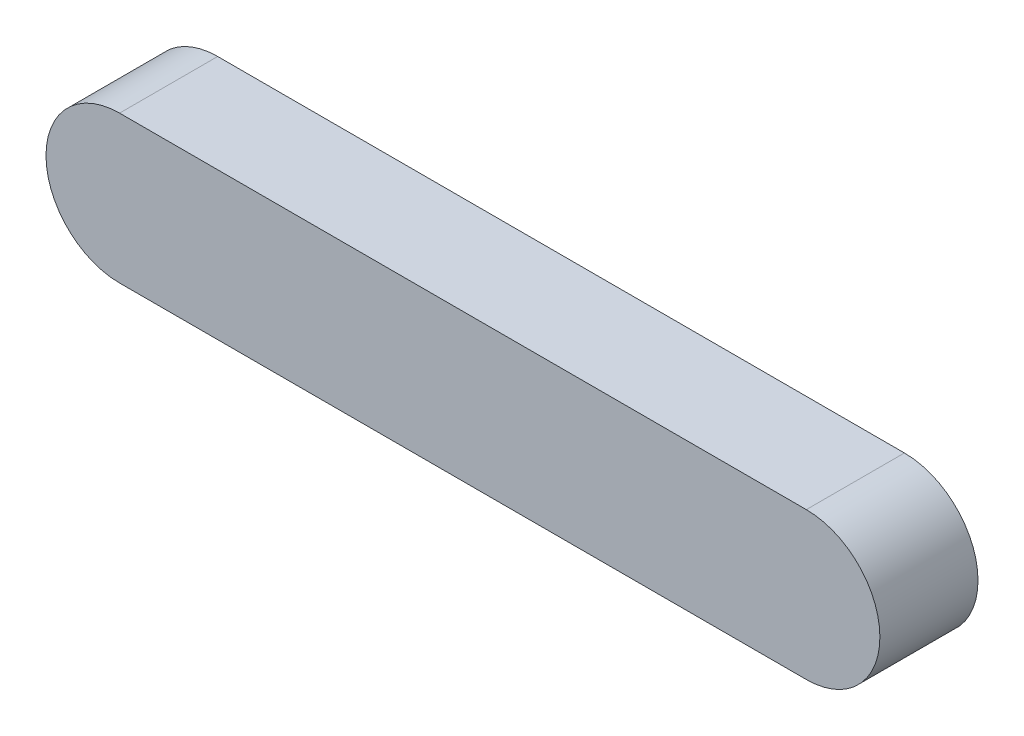
ISO-10303-21;
HEADER;
FILE_DESCRIPTION(('STEP AP214'),'2;1');
FILE_NAME('part.step','',(''),(''),'','','');
FILE_SCHEMA(('AUTOMOTIVE_DESIGN { 1 0 10303 214 1 1 1 1 }'));
ENDSEC;
DATA;
#1=APPLICATION_CONTEXT('core data for automotive mechanical design processes');
#2=APPLICATION_PROTOCOL_DEFINITION('international standard','automotive_design',2000,#1);
#3=PRODUCT_CONTEXT('',#1,'mechanical');
#4=PRODUCT('Part','Part','',(#3));
#5=PRODUCT_RELATED_PRODUCT_CATEGORY('part','',(#4));
#6=PRODUCT_DEFINITION_FORMATION('','',#4);
#7=PRODUCT_DEFINITION_CONTEXT('part definition',#1,'design');
#8=PRODUCT_DEFINITION('design','',#6,#7);
#9=PRODUCT_DEFINITION_SHAPE('','',#8);
#10=(LENGTH_UNIT() NAMED_UNIT(*) SI_UNIT(.MILLI.,.METRE.));
#11=(NAMED_UNIT(*) PLANE_ANGLE_UNIT() SI_UNIT($,.RADIAN.));
#12=(NAMED_UNIT(*) SI_UNIT($,.STERADIAN.) SOLID_ANGLE_UNIT());
#13=UNCERTAINTY_MEASURE_WITH_UNIT(LENGTH_MEASURE(1.E-05),#10,'distance_accuracy_value','');
#14=(GEOMETRIC_REPRESENTATION_CONTEXT(3) GLOBAL_UNCERTAINTY_ASSIGNED_CONTEXT((#13)) GLOBAL_UNIT_ASSIGNED_CONTEXT((#10,
#11,#12)) REPRESENTATION_CONTEXT('',''));
#15=CARTESIAN_POINT('',(0.,0.,0.));
#16=DIRECTION('',(0.,0.,1.));
#17=DIRECTION('',(1.,0.,0.));
#18=AXIS2_PLACEMENT_3D('',#15,#16,#17);
#19=CARTESIAN_POINT('',(70.,0.,10.));
#20=DIRECTION('',(0.,0.,-1.));
#21=DIRECTION('',(-1.,0.,0.));
#22=AXIS2_PLACEMENT_3D('',#19,#20,#21);
#23=CYLINDRICAL_SURFACE('',#22,7.5);
#24=CARTESIAN_POINT('',(70.,0.,0.));
#25=DIRECTION('',(0.,0.,1.));
#26=DIRECTION('',(1.,0.,0.));
#27=AXIS2_PLACEMENT_3D('',#24,#25,#26);
#28=CIRCLE('',#27,7.5);
#29=CARTESIAN_POINT('',(70.,-7.5,0.));
#30=VERTEX_POINT('',#29);
#31=CARTESIAN_POINT('',(70.,7.5,0.));
#32=VERTEX_POINT('',#31);
#33=EDGE_CURVE('E104',#30,#32,#28,.T.);
#34=ORIENTED_EDGE('',*,*,#33,.T.);
#35=DIRECTION('',(0.,0.,-1.));
#36=VECTOR('',#35,1.);
#37=CARTESIAN_POINT('',(70.,7.5,10.));
#38=LINE('',#37,#36);
#39=CARTESIAN_POINT('',(70.,7.5,10.));
#40=VERTEX_POINT('',#39);
#41=EDGE_CURVE('E11',#40,#32,#38,.T.);
#42=ORIENTED_EDGE('',*,*,#41,.F.);
#43=CARTESIAN_POINT('',(70.,0.,10.));
#44=DIRECTION('',(0.,0.,1.));
#45=DIRECTION('',(1.,0.,0.));
#46=AXIS2_PLACEMENT_3D('',#43,#44,#45);
#47=CIRCLE('',#46,7.5);
#48=CARTESIAN_POINT('',(70.,-7.5,10.));
#49=VERTEX_POINT('',#48);
#50=EDGE_CURVE('E92',#49,#40,#47,.T.);
#51=ORIENTED_EDGE('',*,*,#50,.F.);
#52=DIRECTION('',(0.,0.,-1.));
#53=VECTOR('',#52,1.);
#54=CARTESIAN_POINT('',(70.,-7.5,10.));
#55=LINE('',#54,#53);
#56=EDGE_CURVE('E100',#49,#30,#55,.T.);
#57=ORIENTED_EDGE('',*,*,#56,.T.);
#58=EDGE_LOOP('',(#34,#42,#51,#57));
#59=FACE_BOUND('',#58,.T.);
#60=ADVANCED_FACE('F41',(#59),#23,.T.);
#61=CARTESIAN_POINT('',(70.,7.5,10.));
#62=DIRECTION('',(0.,-1.,0.));
#63=DIRECTION('',(1.,0.,0.));
#64=AXIS2_PLACEMENT_3D('',#61,#62,#63);
#65=PLANE('',#64);
#66=DIRECTION('',(-1.,0.,0.));
#67=VECTOR('',#66,1.);
#68=CARTESIAN_POINT('',(70.,7.5,0.));
#69=LINE('',#68,#67);
#70=CARTESIAN_POINT('',(0.,7.5,0.));
#71=VERTEX_POINT('',#70);
#72=EDGE_CURVE('E96',#32,#71,#69,.T.);
#73=ORIENTED_EDGE('',*,*,#72,.T.);
#74=DIRECTION('',(0.,0.,-1.));
#75=VECTOR('',#74,1.);
#76=CARTESIAN_POINT('',(0.,7.5,10.));
#77=LINE('',#76,#75);
#78=CARTESIAN_POINT('',(0.,7.5,10.));
#79=VERTEX_POINT('',#78);
#80=EDGE_CURVE('E49',#79,#71,#77,.T.);
#81=ORIENTED_EDGE('',*,*,#80,.F.);
#82=DIRECTION('',(-1.,0.,0.));
#83=VECTOR('',#82,1.);
#84=CARTESIAN_POINT('',(70.,7.5,10.));
#85=LINE('',#84,#83);
#86=EDGE_CURVE('E87',#40,#79,#85,.T.);
#87=ORIENTED_EDGE('',*,*,#86,.F.);
#88=ORIENTED_EDGE('',*,*,#41,.T.);
#89=EDGE_LOOP('',(#73,#81,#87,#88));
#90=FACE_BOUND('',#89,.T.);
#91=ADVANCED_FACE('F95',(#90),#65,.F.);
#92=CARTESIAN_POINT('',(0.,0.,10.));
#93=DIRECTION('',(0.,0.,-1.));
#94=DIRECTION('',(-1.,0.,0.));
#95=AXIS2_PLACEMENT_3D('',#92,#93,#94);
#96=CYLINDRICAL_SURFACE('',#95,7.5);
#97=CARTESIAN_POINT('',(0.,0.,0.));
#98=DIRECTION('',(0.,0.,1.));
#99=DIRECTION('',(1.,0.,0.));
#100=AXIS2_PLACEMENT_3D('',#97,#98,#99);
#101=CIRCLE('',#100,7.5);
#102=CARTESIAN_POINT('',(0.,-7.5,0.));
#103=VERTEX_POINT('',#102);
#104=EDGE_CURVE('E74',#71,#103,#101,.T.);
#105=ORIENTED_EDGE('',*,*,#104,.T.);
#106=DIRECTION('',(0.,0.,-1.));
#107=VECTOR('',#106,1.);
#108=CARTESIAN_POINT('',(0.,-7.5,10.));
#109=LINE('',#108,#107);
#110=CARTESIAN_POINT('',(0.,-7.5,10.));
#111=VERTEX_POINT('',#110);
#112=EDGE_CURVE('E97',#111,#103,#109,.T.);
#113=ORIENTED_EDGE('',*,*,#112,.F.);
#114=CARTESIAN_POINT('',(0.,0.,10.));
#115=DIRECTION('',(0.,0.,1.));
#116=DIRECTION('',(1.,0.,0.));
#117=AXIS2_PLACEMENT_3D('',#114,#115,#116);
#118=CIRCLE('',#117,7.5);
#119=EDGE_CURVE('E90',#79,#111,#118,.T.);
#120=ORIENTED_EDGE('',*,*,#119,.F.);
#121=ORIENTED_EDGE('',*,*,#80,.T.);
#122=EDGE_LOOP('',(#105,#113,#120,#121));
#123=FACE_BOUND('',#122,.T.);
#124=ADVANCED_FACE('F98',(#123),#96,.T.);
#125=CARTESIAN_POINT('',(70.,-7.5,10.));
#126=DIRECTION('',(0.,1.,0.));
#127=DIRECTION('',(-1.,0.,0.));
#128=AXIS2_PLACEMENT_3D('',#125,#126,#127);
#129=PLANE('',#128);
#130=DIRECTION('',(1.,0.,0.));
#131=VECTOR('',#130,1.);
#132=CARTESIAN_POINT('',(70.,-7.5,0.));
#133=LINE('',#132,#131);
#134=EDGE_CURVE('E80',#103,#30,#133,.T.);
#135=ORIENTED_EDGE('',*,*,#134,.T.);
#136=ORIENTED_EDGE('',*,*,#56,.F.);
#137=DIRECTION('',(1.,0.,0.));
#138=VECTOR('',#137,1.);
#139=CARTESIAN_POINT('',(70.,-7.5,10.));
#140=LINE('',#139,#138);
#141=EDGE_CURVE('E57',#111,#49,#140,.T.);
#142=ORIENTED_EDGE('',*,*,#141,.F.);
#143=ORIENTED_EDGE('',*,*,#112,.T.);
#144=EDGE_LOOP('',(#135,#136,#142,#143));
#145=FACE_BOUND('',#144,.T.);
#146=ADVANCED_FACE('F111',(#145),#129,.F.);
#147=CARTESIAN_POINT('',(70.,0.,10.));
#148=DIRECTION('',(0.,0.,1.));
#149=DIRECTION('',(1.,0.,0.));
#150=AXIS2_PLACEMENT_3D('',#147,#148,#149);
#151=PLANE('',#150);
#152=ORIENTED_EDGE('',*,*,#50,.T.);
#153=ORIENTED_EDGE('',*,*,#86,.T.);
#154=ORIENTED_EDGE('',*,*,#119,.T.);
#155=ORIENTED_EDGE('',*,*,#141,.T.);
#156=EDGE_LOOP('',(#152,#153,#154,#155));
#157=FACE_BOUND('',#156,.T.);
#158=ADVANCED_FACE('F88',(#157),#151,.T.);
#159=CARTESIAN_POINT('',(70.,0.,0.));
#160=DIRECTION('',(0.,0.,1.));
#161=DIRECTION('',(1.,0.,0.));
#162=AXIS2_PLACEMENT_3D('',#159,#160,#161);
#163=PLANE('',#162);
#164=ORIENTED_EDGE('',*,*,#33,.F.);
#165=ORIENTED_EDGE('',*,*,#134,.F.);
#166=ORIENTED_EDGE('',*,*,#104,.F.);
#167=ORIENTED_EDGE('',*,*,#72,.F.);
#168=EDGE_LOOP('',(#164,#165,#166,#167));
#169=FACE_BOUND('',#168,.T.);
#170=ADVANCED_FACE('F114',(#169),#163,.F.);
#171=CLOSED_SHELL('',(#60,#91,#124,#146,#158,#170));
#172=MANIFOLD_SOLID_BREP('B2',#171);
#173=ADVANCED_BREP_SHAPE_REPRESENTATION('',(#18,#172),#14);
#174=SHAPE_DEFINITION_REPRESENTATION(#9,#173);
ENDSEC;
END-ISO-10303-21;
